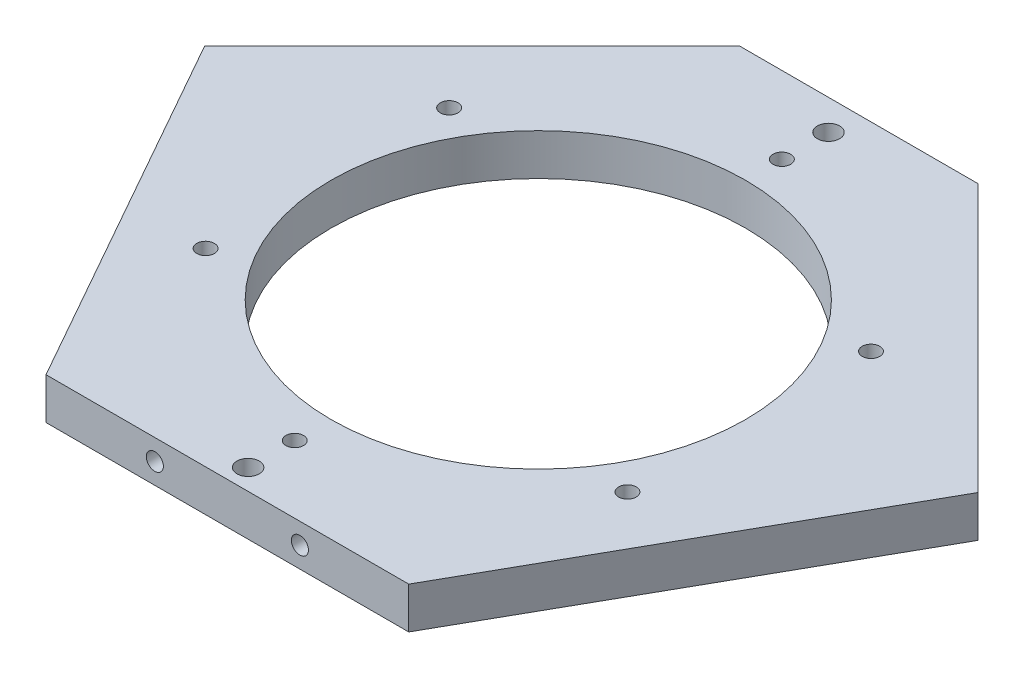
ISO-10303-21;
HEADER;
FILE_DESCRIPTION(('STEP AP214'),'2;1');
FILE_NAME('part.step','',(''),(''),'','','');
FILE_SCHEMA(('AUTOMOTIVE_DESIGN { 1 0 10303 214 1 1 1 1 }'));
ENDSEC;
DATA;
#1=APPLICATION_CONTEXT('core data for automotive mechanical design processes');
#2=APPLICATION_PROTOCOL_DEFINITION('international standard','automotive_design',2000,#1);
#3=PRODUCT_CONTEXT('',#1,'mechanical');
#4=PRODUCT('Part','Part','',(#3));
#5=PRODUCT_RELATED_PRODUCT_CATEGORY('part','',(#4));
#6=PRODUCT_DEFINITION_FORMATION('','',#4);
#7=PRODUCT_DEFINITION_CONTEXT('part definition',#1,'design');
#8=PRODUCT_DEFINITION('design','',#6,#7);
#9=PRODUCT_DEFINITION_SHAPE('','',#8);
#10=(LENGTH_UNIT() NAMED_UNIT(*) SI_UNIT(.MILLI.,.METRE.));
#11=(NAMED_UNIT(*) PLANE_ANGLE_UNIT() SI_UNIT($,.RADIAN.));
#12=(NAMED_UNIT(*) SI_UNIT($,.STERADIAN.) SOLID_ANGLE_UNIT());
#13=UNCERTAINTY_MEASURE_WITH_UNIT(LENGTH_MEASURE(1.E-05),#10,'distance_accuracy_value','');
#14=(GEOMETRIC_REPRESENTATION_CONTEXT(3) GLOBAL_UNCERTAINTY_ASSIGNED_CONTEXT((#13)) GLOBAL_UNIT_ASSIGNED_CONTEXT((#10,
#11,#12)) REPRESENTATION_CONTEXT('',''));
#15=CARTESIAN_POINT('',(0.,0.,0.));
#16=DIRECTION('',(0.,0.,1.));
#17=DIRECTION('',(1.,0.,0.));
#18=AXIS2_PLACEMENT_3D('',#15,#16,#17);
#19=CARTESIAN_POINT('',(0.,4.,0.));
#20=DIRECTION('',(0.,1.,0.));
#21=DIRECTION('',(0.,0.,1.));
#22=AXIS2_PLACEMENT_3D('',#19,#20,#21);
#23=PLANE('',#22);
#24=CARTESIAN_POINT('',(0.,4.,-56.));
#25=DIRECTION('',(0.,1.,0.));
#26=DIRECTION('',(0.,0.,1.));
#27=AXIS2_PLACEMENT_3D('',#24,#25,#26);
#28=CIRCLE('',#27,2.15);
#29=CARTESIAN_POINT('',(0.,4.,-53.85));
#30=VERTEX_POINT('',#29);
#31=EDGE_CURVE('E266',#30,#30,#28,.T.);
#32=ORIENTED_EDGE('',*,*,#31,.F.);
#33=EDGE_LOOP('',(#32));
#34=FACE_BOUND('',#33,.T.);
#35=CARTESIAN_POINT('',(0.,4.,56.));
#36=DIRECTION('',(0.,1.,0.));
#37=DIRECTION('',(0.,0.,1.));
#38=AXIS2_PLACEMENT_3D('',#35,#36,#37);
#39=CIRCLE('',#38,2.15);
#40=CARTESIAN_POINT('',(0.,4.,58.15));
#41=VERTEX_POINT('',#40);
#42=EDGE_CURVE('E270',#41,#41,#39,.T.);
#43=ORIENTED_EDGE('',*,*,#42,.F.);
#44=EDGE_LOOP('',(#43));
#45=FACE_BOUND('',#44,.T.);
#46=CARTESIAN_POINT('',(0.,4.,-47.));
#47=DIRECTION('',(0.,1.,0.));
#48=DIRECTION('',(0.,0.,1.));
#49=AXIS2_PLACEMENT_3D('',#46,#47,#48);
#50=CIRCLE('',#49,1.69999999999999);
#51=CARTESIAN_POINT('',(0.,4.,-45.3));
#52=VERTEX_POINT('',#51);
#53=EDGE_CURVE('E316',#52,#52,#50,.T.);
#54=ORIENTED_EDGE('',*,*,#53,.F.);
#55=EDGE_LOOP('',(#54));
#56=FACE_BOUND('',#55,.T.);
#57=CARTESIAN_POINT('',(40.7031939778709,4.,-23.5000000000041));
#58=DIRECTION('',(0.,1.,0.));
#59=DIRECTION('',(0.,0.,1.));
#60=AXIS2_PLACEMENT_3D('',#57,#58,#59);
#61=CIRCLE('',#60,1.69999999999999);
#62=CARTESIAN_POINT('',(40.7031939778709,4.,-21.8000000000041));
#63=VERTEX_POINT('',#62);
#64=EDGE_CURVE('E323',#63,#63,#61,.T.);
#65=ORIENTED_EDGE('',*,*,#64,.F.);
#66=EDGE_LOOP('',(#65));
#67=FACE_BOUND('',#66,.T.);
#68=CARTESIAN_POINT('',(40.7031939778756,4.,23.4999999999959));
#69=DIRECTION('',(0.,1.,0.));
#70=DIRECTION('',(0.,0.,1.));
#71=AXIS2_PLACEMENT_3D('',#68,#69,#70);
#72=CIRCLE('',#71,1.69999999999999);
#73=CARTESIAN_POINT('',(40.7031939778756,4.,25.1999999999959));
#74=VERTEX_POINT('',#73);
#75=EDGE_CURVE('E329',#74,#74,#72,.T.);
#76=ORIENTED_EDGE('',*,*,#75,.F.);
#77=EDGE_LOOP('',(#76));
#78=FACE_BOUND('',#77,.T.);
#79=CARTESIAN_POINT('',(9.33923072269093E-12,4.,47.));
#80=DIRECTION('',(0.,1.,0.));
#81=DIRECTION('',(0.,0.,1.));
#82=AXIS2_PLACEMENT_3D('',#79,#80,#81);
#83=CIRCLE('',#82,1.69999999999999);
#84=CARTESIAN_POINT('',(9.33923072269093E-12,4.,48.7));
#85=VERTEX_POINT('',#84);
#86=EDGE_CURVE('E335',#85,#85,#83,.T.);
#87=ORIENTED_EDGE('',*,*,#86,.F.);
#88=EDGE_LOOP('',(#87));
#89=FACE_BOUND('',#88,.T.);
#90=CARTESIAN_POINT('',(-40.7031939778616,4.,23.5000000000041));
#91=DIRECTION('',(0.,1.,0.));
#92=DIRECTION('',(0.,0.,1.));
#93=AXIS2_PLACEMENT_3D('',#90,#91,#92);
#94=CIRCLE('',#93,1.69999999999999);
#95=CARTESIAN_POINT('',(-40.7031939778616,4.,25.200000000004));
#96=VERTEX_POINT('',#95);
#97=EDGE_CURVE('E343',#96,#96,#94,.T.);
#98=ORIENTED_EDGE('',*,*,#97,.F.);
#99=EDGE_LOOP('',(#98));
#100=FACE_BOUND('',#99,.T.);
#101=CARTESIAN_POINT('',(-40.7031939778663,4.,-23.499999999996));
#102=DIRECTION('',(0.,1.,0.));
#103=DIRECTION('',(0.,0.,1.));
#104=AXIS2_PLACEMENT_3D('',#101,#102,#103);
#105=CIRCLE('',#104,1.69999999999999);
#106=CARTESIAN_POINT('',(-40.7031939778663,4.,-21.799999999996));
#107=VERTEX_POINT('',#106);
#108=EDGE_CURVE('E350',#107,#107,#105,.T.);
#109=ORIENTED_EDGE('',*,*,#108,.F.);
#110=EDGE_LOOP('',(#109));
#111=FACE_BOUND('',#110,.T.);
#112=DIRECTION('',(-0.707106781186547,0.,-0.707106781186548));
#113=VECTOR('',#112,1.);
#114=CARTESIAN_POINT('',(74.6187950266179,4.,-10.2340187157677));
#115=LINE('',#114,#113);
#116=CARTESIAN_POINT('',(74.6187950266179,4.,-10.2340187157677));
#117=VERTEX_POINT('',#116);
#118=CARTESIAN_POINT('',(23.,4.,-61.8528137423857));
#119=VERTEX_POINT('',#118);
#120=EDGE_CURVE('E144',#117,#119,#115,.T.);
#121=ORIENTED_EDGE('',*,*,#120,.T.);
#122=DIRECTION('',(-1.,0.,0.));
#123=VECTOR('',#122,1.);
#124=CARTESIAN_POINT('',(23.,4.,-61.8528137423857));
#125=LINE('',#124,#123);
#126=CARTESIAN_POINT('',(-23.,4.,-61.8528137423857));
#127=VERTEX_POINT('',#126);
#128=EDGE_CURVE('E100',#119,#127,#125,.T.);
#129=ORIENTED_EDGE('',*,*,#128,.T.);
#130=DIRECTION('',(-0.707106781186547,0.,0.707106781186548));
#131=VECTOR('',#130,1.);
#132=CARTESIAN_POINT('',(-23.,4.,-61.8528137423857));
#133=LINE('',#132,#131);
#134=CARTESIAN_POINT('',(-74.6187950266179,4.,-10.2340187157677));
#135=VERTEX_POINT('',#134);
#136=EDGE_CURVE('E115',#127,#135,#133,.T.);
#137=ORIENTED_EDGE('',*,*,#136,.T.);
#138=DIRECTION('',(0.491317470780659,0.,0.870980564022927));
#139=VECTOR('',#138,1.);
#140=CARTESIAN_POINT('',(-74.6187950266179,4.,-10.2340187157677));
#141=LINE('',#140,#139);
#142=CARTESIAN_POINT('',(-35.,4.,60.));
#143=VERTEX_POINT('',#142);
#144=EDGE_CURVE('E109',#135,#143,#141,.T.);
#145=ORIENTED_EDGE('',*,*,#144,.T.);
#146=DIRECTION('',(1.,0.,0.));
#147=VECTOR('',#146,1.);
#148=CARTESIAN_POINT('',(-35.,4.,60.));
#149=LINE('',#148,#147);
#150=CARTESIAN_POINT('',(35.,4.,60.));
#151=VERTEX_POINT('',#150);
#152=EDGE_CURVE('E113',#143,#151,#149,.T.);
#153=ORIENTED_EDGE('',*,*,#152,.T.);
#154=DIRECTION('',(0.491317470780659,0.,-0.870980564022927));
#155=VECTOR('',#154,1.);
#156=CARTESIAN_POINT('',(35.,4.,60.));
#157=LINE('',#156,#155);
#158=EDGE_CURVE('E62',#151,#117,#157,.T.);
#159=ORIENTED_EDGE('',*,*,#158,.T.);
#160=EDGE_LOOP('',(#121,#129,#137,#145,#153,#159));
#161=FACE_BOUND('',#160,.T.);
#162=CARTESIAN_POINT('',(0.,4.,0.));
#163=DIRECTION('',(0.,1.,0.));
#164=DIRECTION('',(0.,0.,1.));
#165=AXIS2_PLACEMENT_3D('',#162,#163,#164);
#166=CIRCLE('',#165,40.);
#167=CARTESIAN_POINT('',(0.,4.,40.));
#168=VERTEX_POINT('',#167);
#169=EDGE_CURVE('E137',#168,#168,#166,.T.);
#170=ORIENTED_EDGE('',*,*,#169,.F.);
#171=EDGE_LOOP('',(#170));
#172=FACE_BOUND('',#171,.T.);
#173=ADVANCED_FACE('F45',(#34,#45,#56,#67,#78,#89,#100,#111,#161,#172),#23,.T.);
#174=CARTESIAN_POINT('',(0.,-4.,0.));
#175=DIRECTION('',(0.,1.,0.));
#176=DIRECTION('',(0.,0.,1.));
#177=AXIS2_PLACEMENT_3D('',#174,#175,#176);
#178=PLANE('',#177);
#179=CARTESIAN_POINT('',(0.,-4.,-56.));
#180=DIRECTION('',(0.,1.,0.));
#181=DIRECTION('',(0.,0.,1.));
#182=AXIS2_PLACEMENT_3D('',#179,#180,#181);
#183=CIRCLE('',#182,2.15);
#184=CARTESIAN_POINT('',(0.,-4.,-53.85));
#185=VERTEX_POINT('',#184);
#186=EDGE_CURVE('E264',#185,#185,#183,.T.);
#187=ORIENTED_EDGE('',*,*,#186,.T.);
#188=EDGE_LOOP('',(#187));
#189=FACE_BOUND('',#188,.T.);
#190=CARTESIAN_POINT('',(0.,-4.,56.));
#191=DIRECTION('',(0.,1.,0.));
#192=DIRECTION('',(0.,0.,1.));
#193=AXIS2_PLACEMENT_3D('',#190,#191,#192);
#194=CIRCLE('',#193,2.15);
#195=CARTESIAN_POINT('',(0.,-4.,58.15));
#196=VERTEX_POINT('',#195);
#197=EDGE_CURVE('E275',#196,#196,#194,.T.);
#198=ORIENTED_EDGE('',*,*,#197,.T.);
#199=EDGE_LOOP('',(#198));
#200=FACE_BOUND('',#199,.T.);
#201=CARTESIAN_POINT('',(0.,-4.,-47.));
#202=DIRECTION('',(0.,1.,0.));
#203=DIRECTION('',(0.,0.,1.));
#204=AXIS2_PLACEMENT_3D('',#201,#202,#203);
#205=CIRCLE('',#204,1.7);
#206=CARTESIAN_POINT('',(0.,-4.,-45.3));
#207=VERTEX_POINT('',#206);
#208=EDGE_CURVE('E319',#207,#207,#205,.T.);
#209=ORIENTED_EDGE('',*,*,#208,.T.);
#210=EDGE_LOOP('',(#209));
#211=FACE_BOUND('',#210,.T.);
#212=CARTESIAN_POINT('',(40.7031939778709,-4.,-23.5000000000041));
#213=DIRECTION('',(0.,1.,0.));
#214=DIRECTION('',(0.,0.,1.));
#215=AXIS2_PLACEMENT_3D('',#212,#213,#214);
#216=CIRCLE('',#215,1.7);
#217=CARTESIAN_POINT('',(40.7031939778709,-4.,-21.800000000004));
#218=VERTEX_POINT('',#217);
#219=EDGE_CURVE('E326',#218,#218,#216,.T.);
#220=ORIENTED_EDGE('',*,*,#219,.T.);
#221=EDGE_LOOP('',(#220));
#222=FACE_BOUND('',#221,.T.);
#223=CARTESIAN_POINT('',(40.7031939778756,-4.,23.4999999999959));
#224=DIRECTION('',(0.,1.,0.));
#225=DIRECTION('',(0.,0.,1.));
#226=AXIS2_PLACEMENT_3D('',#223,#224,#225);
#227=CIRCLE('',#226,1.7);
#228=CARTESIAN_POINT('',(40.7031939778756,-4.,25.199999999996));
#229=VERTEX_POINT('',#228);
#230=EDGE_CURVE('E332',#229,#229,#227,.T.);
#231=ORIENTED_EDGE('',*,*,#230,.T.);
#232=EDGE_LOOP('',(#231));
#233=FACE_BOUND('',#232,.T.);
#234=CARTESIAN_POINT('',(9.33923072269093E-12,-4.,47.));
#235=DIRECTION('',(0.,1.,0.));
#236=DIRECTION('',(0.,0.,1.));
#237=AXIS2_PLACEMENT_3D('',#234,#235,#236);
#238=CIRCLE('',#237,1.7);
#239=CARTESIAN_POINT('',(9.33923072269093E-12,-4.,48.7));
#240=VERTEX_POINT('',#239);
#241=EDGE_CURVE('E339',#240,#240,#238,.T.);
#242=ORIENTED_EDGE('',*,*,#241,.T.);
#243=EDGE_LOOP('',(#242));
#244=FACE_BOUND('',#243,.T.);
#245=CARTESIAN_POINT('',(-40.7031939778616,-4.,23.5000000000041));
#246=DIRECTION('',(0.,1.,0.));
#247=DIRECTION('',(0.,0.,1.));
#248=AXIS2_PLACEMENT_3D('',#245,#246,#247);
#249=CIRCLE('',#248,1.7);
#250=CARTESIAN_POINT('',(-40.7031939778616,-4.,25.2000000000041));
#251=VERTEX_POINT('',#250);
#252=EDGE_CURVE('E347',#251,#251,#249,.T.);
#253=ORIENTED_EDGE('',*,*,#252,.T.);
#254=EDGE_LOOP('',(#253));
#255=FACE_BOUND('',#254,.T.);
#256=CARTESIAN_POINT('',(-40.7031939778663,-4.,-23.499999999996));
#257=DIRECTION('',(0.,1.,0.));
#258=DIRECTION('',(0.,0.,1.));
#259=AXIS2_PLACEMENT_3D('',#256,#257,#258);
#260=CIRCLE('',#259,1.7);
#261=CARTESIAN_POINT('',(-40.7031939778663,-4.,-21.799999999996));
#262=VERTEX_POINT('',#261);
#263=EDGE_CURVE('E353',#262,#262,#260,.T.);
#264=ORIENTED_EDGE('',*,*,#263,.T.);
#265=EDGE_LOOP('',(#264));
#266=FACE_BOUND('',#265,.T.);
#267=DIRECTION('',(-0.707106781186547,0.,-0.707106781186548));
#268=VECTOR('',#267,1.);
#269=CARTESIAN_POINT('',(74.6187950266179,-4.,-10.2340187157677));
#270=LINE('',#269,#268);
#271=CARTESIAN_POINT('',(74.6187950266179,-4.,-10.2340187157677));
#272=VERTEX_POINT('',#271);
#273=CARTESIAN_POINT('',(23.,-4.,-61.8528137423857));
#274=VERTEX_POINT('',#273);
#275=EDGE_CURVE('E133',#272,#274,#270,.T.);
#276=ORIENTED_EDGE('',*,*,#275,.F.);
#277=DIRECTION('',(0.491317470780659,0.,-0.870980564022927));
#278=VECTOR('',#277,1.);
#279=CARTESIAN_POINT('',(35.,-4.,60.));
#280=LINE('',#279,#278);
#281=CARTESIAN_POINT('',(35.,-4.,60.));
#282=VERTEX_POINT('',#281);
#283=EDGE_CURVE('E92',#282,#272,#280,.T.);
#284=ORIENTED_EDGE('',*,*,#283,.F.);
#285=DIRECTION('',(1.,0.,0.));
#286=VECTOR('',#285,1.);
#287=CARTESIAN_POINT('',(-35.,-4.,60.));
#288=LINE('',#287,#286);
#289=CARTESIAN_POINT('',(-35.,-4.,60.));
#290=VERTEX_POINT('',#289);
#291=EDGE_CURVE('E86',#290,#282,#288,.T.);
#292=ORIENTED_EDGE('',*,*,#291,.F.);
#293=DIRECTION('',(0.491317470780659,0.,0.870980564022927));
#294=VECTOR('',#293,1.);
#295=CARTESIAN_POINT('',(-74.6187950266179,-4.,-10.2340187157677));
#296=LINE('',#295,#294);
#297=CARTESIAN_POINT('',(-74.6187950266179,-4.,-10.2340187157677));
#298=VERTEX_POINT('',#297);
#299=EDGE_CURVE('E123',#298,#290,#296,.T.);
#300=ORIENTED_EDGE('',*,*,#299,.F.);
#301=DIRECTION('',(-0.707106781186547,0.,0.707106781186548));
#302=VECTOR('',#301,1.);
#303=CARTESIAN_POINT('',(-23.,-4.,-61.8528137423857));
#304=LINE('',#303,#302);
#305=CARTESIAN_POINT('',(-23.,-4.,-61.8528137423857));
#306=VERTEX_POINT('',#305);
#307=EDGE_CURVE('E139',#306,#298,#304,.T.);
#308=ORIENTED_EDGE('',*,*,#307,.F.);
#309=DIRECTION('',(-1.,0.,0.));
#310=VECTOR('',#309,1.);
#311=CARTESIAN_POINT('',(23.,-4.,-61.8528137423857));
#312=LINE('',#311,#310);
#313=EDGE_CURVE('E136',#274,#306,#312,.T.);
#314=ORIENTED_EDGE('',*,*,#313,.F.);
#315=EDGE_LOOP('',(#276,#284,#292,#300,#308,#314));
#316=FACE_BOUND('',#315,.T.);
#317=CARTESIAN_POINT('',(0.,-4.,0.));
#318=DIRECTION('',(0.,1.,0.));
#319=DIRECTION('',(0.,0.,1.));
#320=AXIS2_PLACEMENT_3D('',#317,#318,#319);
#321=CIRCLE('',#320,40.);
#322=CARTESIAN_POINT('',(0.,-4.,40.));
#323=VERTEX_POINT('',#322);
#324=EDGE_CURVE('E356',#323,#323,#321,.T.);
#325=ORIENTED_EDGE('',*,*,#324,.T.);
#326=EDGE_LOOP('',(#325));
#327=FACE_BOUND('',#326,.T.);
#328=ADVANCED_FACE('F153',(#189,#200,#211,#222,#233,#244,#255,#266,#316,#327),#178,.F.);
#329=CARTESIAN_POINT('',(74.6187950266179,4.,-10.2340187157677));
#330=DIRECTION('',(-0.707106781186548,0.,0.707106781186547));
#331=DIRECTION('',(0.707106781186547,0.,0.707106781186548));
#332=AXIS2_PLACEMENT_3D('',#329,#330,#331);
#333=PLANE('',#332);
#334=CARTESIAN_POINT('',(38.8201622871415,0.,-46.0326514552443));
#335=DIRECTION('',(0.707106781186548,0.,-0.707106781186548));
#336=DIRECTION('',(-0.707106781186548,0.,-0.707106781186548));
#337=AXIS2_PLACEMENT_3D('',#334,#335,#336);
#338=CIRCLE('',#337,1.64999999999999);
#339=CARTESIAN_POINT('',(37.6534360981837,0.,-47.199377644202));
#340=VERTEX_POINT('',#339);
#341=EDGE_CURVE('E304',#340,#340,#338,.T.);
#342=ORIENTED_EDGE('',*,*,#341,.F.);
#343=EDGE_LOOP('',(#342));
#344=FACE_BOUND('',#343,.T.);
#345=CARTESIAN_POINT('',(58.6191521603648,0.,-26.2336615820209));
#346=DIRECTION('',(0.707106781186548,0.,-0.707106781186548));
#347=DIRECTION('',(-0.707106781186548,0.,-0.707106781186548));
#348=AXIS2_PLACEMENT_3D('',#345,#346,#347);
#349=CIRCLE('',#348,1.64999999999999);
#350=CARTESIAN_POINT('',(57.452425971407,0.,-27.4003877709787));
#351=VERTEX_POINT('',#350);
#352=EDGE_CURVE('E310',#351,#351,#349,.T.);
#353=ORIENTED_EDGE('',*,*,#352,.F.);
#354=EDGE_LOOP('',(#353));
#355=FACE_BOUND('',#354,.T.);
#356=ORIENTED_EDGE('',*,*,#275,.T.);
#357=DIRECTION('',(0.,-1.,0.));
#358=VECTOR('',#357,1.);
#359=CARTESIAN_POINT('',(23.,4.,-61.8528137423857));
#360=LINE('',#359,#358);
#361=EDGE_CURVE('E11',#119,#274,#360,.T.);
#362=ORIENTED_EDGE('',*,*,#361,.F.);
#363=ORIENTED_EDGE('',*,*,#120,.F.);
#364=DIRECTION('',(0.,-1.,0.));
#365=VECTOR('',#364,1.);
#366=CARTESIAN_POINT('',(74.6187950266179,4.,-10.2340187157677));
#367=LINE('',#366,#365);
#368=EDGE_CURVE('E129',#117,#272,#367,.T.);
#369=ORIENTED_EDGE('',*,*,#368,.T.);
#370=EDGE_LOOP('',(#356,#362,#363,#369));
#371=FACE_BOUND('',#370,.T.);
#372=ADVANCED_FACE('F47',(#344,#355,#371),#333,.F.);
#373=CARTESIAN_POINT('',(23.,4.,-61.8528137423857));
#374=DIRECTION('',(0.,0.,1.));
#375=DIRECTION('',(1.,0.,0.));
#376=AXIS2_PLACEMENT_3D('',#373,#374,#375);
#377=PLANE('',#376);
#378=ORIENTED_EDGE('',*,*,#313,.T.);
#379=DIRECTION('',(0.,-1.,0.));
#380=VECTOR('',#379,1.);
#381=CARTESIAN_POINT('',(-23.,4.,-61.8528137423857));
#382=LINE('',#381,#380);
#383=EDGE_CURVE('E54',#127,#306,#382,.T.);
#384=ORIENTED_EDGE('',*,*,#383,.F.);
#385=ORIENTED_EDGE('',*,*,#128,.F.);
#386=ORIENTED_EDGE('',*,*,#361,.T.);
#387=EDGE_LOOP('',(#378,#384,#385,#386));
#388=FACE_BOUND('',#387,.T.);
#389=ADVANCED_FACE('F403',(#388),#377,.F.);
#390=CARTESIAN_POINT('',(-23.,4.,-61.8528137423857));
#391=DIRECTION('',(0.707106781186548,0.,0.707106781186547));
#392=DIRECTION('',(0.707106781186547,0.,-0.707106781186548));
#393=AXIS2_PLACEMENT_3D('',#390,#391,#392);
#394=PLANE('',#393);
#395=CARTESIAN_POINT('',(-38.8201622871415,0.,-46.0326514552443));
#396=DIRECTION('',(-0.707106781186548,0.,-0.707106781186548));
#397=DIRECTION('',(-0.707106781186548,0.,0.707106781186548));
#398=AXIS2_PLACEMENT_3D('',#395,#396,#397);
#399=CIRCLE('',#398,1.64999999999999);
#400=CARTESIAN_POINT('',(-39.9868884760993,0.,-44.8659252662865));
#401=VERTEX_POINT('',#400);
#402=EDGE_CURVE('E292',#401,#401,#399,.T.);
#403=ORIENTED_EDGE('',*,*,#402,.F.);
#404=EDGE_LOOP('',(#403));
#405=FACE_BOUND('',#404,.T.);
#406=CARTESIAN_POINT('',(-58.6191521603648,0.,-26.2336615820209));
#407=DIRECTION('',(-0.707106781186548,0.,-0.707106781186548));
#408=DIRECTION('',(-0.707106781186548,0.,0.707106781186548));
#409=AXIS2_PLACEMENT_3D('',#406,#407,#408);
#410=CIRCLE('',#409,1.64999999999999);
#411=CARTESIAN_POINT('',(-59.7858783493226,0.,-25.0669353930631));
#412=VERTEX_POINT('',#411);
#413=EDGE_CURVE('E298',#412,#412,#410,.T.);
#414=ORIENTED_EDGE('',*,*,#413,.F.);
#415=EDGE_LOOP('',(#414));
#416=FACE_BOUND('',#415,.T.);
#417=ORIENTED_EDGE('',*,*,#307,.T.);
#418=DIRECTION('',(0.,-1.,0.));
#419=VECTOR('',#418,1.);
#420=CARTESIAN_POINT('',(-74.6187950266179,4.,-10.2340187157677));
#421=LINE('',#420,#419);
#422=EDGE_CURVE('E124',#135,#298,#421,.T.);
#423=ORIENTED_EDGE('',*,*,#422,.F.);
#424=ORIENTED_EDGE('',*,*,#136,.F.);
#425=ORIENTED_EDGE('',*,*,#383,.T.);
#426=EDGE_LOOP('',(#417,#423,#424,#425));
#427=FACE_BOUND('',#426,.T.);
#428=ADVANCED_FACE('F150',(#405,#416,#427),#394,.F.);
#429=CARTESIAN_POINT('',(-74.6187950266179,4.,-10.2340187157677));
#430=DIRECTION('',(0.870980564022927,0.,-0.491317470780659));
#431=DIRECTION('',(-0.491317470780659,0.,-0.870980564022927));
#432=AXIS2_PLACEMENT_3D('',#429,#430,#431);
#433=PLANE('',#432);
#434=ORIENTED_EDGE('',*,*,#299,.T.);
#435=DIRECTION('',(0.,-1.,0.));
#436=VECTOR('',#435,1.);
#437=CARTESIAN_POINT('',(-35.,4.,60.));
#438=LINE('',#437,#436);
#439=EDGE_CURVE('E120',#143,#290,#438,.T.);
#440=ORIENTED_EDGE('',*,*,#439,.F.);
#441=ORIENTED_EDGE('',*,*,#144,.F.);
#442=ORIENTED_EDGE('',*,*,#422,.T.);
#443=EDGE_LOOP('',(#434,#440,#441,#442));
#444=FACE_BOUND('',#443,.T.);
#445=ADVANCED_FACE('F121',(#444),#433,.F.);
#446=CARTESIAN_POINT('',(-35.,4.,60.));
#447=DIRECTION('',(0.,0.,-1.));
#448=DIRECTION('',(-1.,0.,0.));
#449=AXIS2_PLACEMENT_3D('',#446,#447,#448);
#450=PLANE('',#449);
#451=CARTESIAN_POINT('',(14.,0.,60.));
#452=DIRECTION('',(0.,0.,1.));
#453=DIRECTION('',(1.,0.,0.));
#454=AXIS2_PLACEMENT_3D('',#451,#452,#453);
#455=CIRCLE('',#454,1.64999999999999);
#456=CARTESIAN_POINT('',(15.65,0.,60.));
#457=VERTEX_POINT('',#456);
#458=EDGE_CURVE('E279',#457,#457,#455,.T.);
#459=ORIENTED_EDGE('',*,*,#458,.F.);
#460=EDGE_LOOP('',(#459));
#461=FACE_BOUND('',#460,.T.);
#462=CARTESIAN_POINT('',(-14.,0.,60.));
#463=DIRECTION('',(0.,0.,1.));
#464=DIRECTION('',(1.,0.,0.));
#465=AXIS2_PLACEMENT_3D('',#462,#463,#464);
#466=CIRCLE('',#465,1.64999999999999);
#467=CARTESIAN_POINT('',(-12.35,0.,60.));
#468=VERTEX_POINT('',#467);
#469=EDGE_CURVE('E285',#468,#468,#466,.T.);
#470=ORIENTED_EDGE('',*,*,#469,.F.);
#471=EDGE_LOOP('',(#470));
#472=FACE_BOUND('',#471,.T.);
#473=ORIENTED_EDGE('',*,*,#291,.T.);
#474=DIRECTION('',(0.,-1.,0.));
#475=VECTOR('',#474,1.);
#476=CARTESIAN_POINT('',(35.,4.,60.));
#477=LINE('',#476,#475);
#478=EDGE_CURVE('E125',#151,#282,#477,.T.);
#479=ORIENTED_EDGE('',*,*,#478,.F.);
#480=ORIENTED_EDGE('',*,*,#152,.F.);
#481=ORIENTED_EDGE('',*,*,#439,.T.);
#482=EDGE_LOOP('',(#473,#479,#480,#481));
#483=FACE_BOUND('',#482,.T.);
#484=ADVANCED_FACE('F127',(#461,#472,#483),#450,.F.);
#485=CARTESIAN_POINT('',(35.,4.,60.));
#486=DIRECTION('',(-0.870980564022927,0.,-0.491317470780659));
#487=DIRECTION('',(-0.491317470780659,0.,0.870980564022927));
#488=AXIS2_PLACEMENT_3D('',#485,#486,#487);
#489=PLANE('',#488);
#490=ORIENTED_EDGE('',*,*,#283,.T.);
#491=ORIENTED_EDGE('',*,*,#368,.F.);
#492=ORIENTED_EDGE('',*,*,#158,.F.);
#493=ORIENTED_EDGE('',*,*,#478,.T.);
#494=EDGE_LOOP('',(#490,#491,#492,#493));
#495=FACE_BOUND('',#494,.T.);
#496=ADVANCED_FACE('F158',(#495),#489,.F.);
#497=CARTESIAN_POINT('',(0.,4.,0.));
#498=DIRECTION('',(0.,-1.,0.));
#499=DIRECTION('',(0.,0.,-1.));
#500=AXIS2_PLACEMENT_3D('',#497,#498,#499);
#501=CYLINDRICAL_SURFACE('',#500,40.);
#502=ORIENTED_EDGE('',*,*,#169,.T.);
#503=EDGE_LOOP('',(#502));
#504=FACE_BOUND('',#503,.T.);
#505=ORIENTED_EDGE('',*,*,#324,.F.);
#506=EDGE_LOOP('',(#505));
#507=FACE_BOUND('',#506,.T.);
#508=ADVANCED_FACE('F160',(#504,#507),#501,.F.);
#509=CARTESIAN_POINT('',(-40.7031939778663,4.,-23.499999999996));
#510=DIRECTION('',(0.,1.,0.));
#511=DIRECTION('',(0.,0.,1.));
#512=AXIS2_PLACEMENT_3D('',#509,#510,#511);
#513=CYLINDRICAL_SURFACE('',#512,1.69999999999999);
#514=ORIENTED_EDGE('',*,*,#263,.F.);
#515=EDGE_LOOP('',(#514));
#516=FACE_BOUND('',#515,.T.);
#517=ORIENTED_EDGE('',*,*,#108,.T.);
#518=EDGE_LOOP('',(#517));
#519=FACE_BOUND('',#518,.T.);
#520=ADVANCED_FACE('F166',(#516,#519),#513,.F.);
#521=CARTESIAN_POINT('',(-40.7031939778616,4.,23.5000000000041));
#522=DIRECTION('',(0.,1.,0.));
#523=DIRECTION('',(0.,0.,1.));
#524=AXIS2_PLACEMENT_3D('',#521,#522,#523);
#525=CYLINDRICAL_SURFACE('',#524,1.69999999999999);
#526=ORIENTED_EDGE('',*,*,#252,.F.);
#527=EDGE_LOOP('',(#526));
#528=FACE_BOUND('',#527,.T.);
#529=ORIENTED_EDGE('',*,*,#97,.T.);
#530=EDGE_LOOP('',(#529));
#531=FACE_BOUND('',#530,.T.);
#532=ADVANCED_FACE('F184',(#528,#531),#525,.F.);
#533=CARTESIAN_POINT('',(9.33923072269093E-12,4.,47.));
#534=DIRECTION('',(0.,1.,0.));
#535=DIRECTION('',(0.,0.,1.));
#536=AXIS2_PLACEMENT_3D('',#533,#534,#535);
#537=CYLINDRICAL_SURFACE('',#536,1.69999999999999);
#538=ORIENTED_EDGE('',*,*,#241,.F.);
#539=EDGE_LOOP('',(#538));
#540=FACE_BOUND('',#539,.T.);
#541=ORIENTED_EDGE('',*,*,#86,.T.);
#542=EDGE_LOOP('',(#541));
#543=FACE_BOUND('',#542,.T.);
#544=ADVANCED_FACE('F188',(#540,#543),#537,.F.);
#545=CARTESIAN_POINT('',(40.7031939778756,4.,23.4999999999959));
#546=DIRECTION('',(0.,1.,0.));
#547=DIRECTION('',(0.,0.,1.));
#548=AXIS2_PLACEMENT_3D('',#545,#546,#547);
#549=CYLINDRICAL_SURFACE('',#548,1.69999999999999);
#550=ORIENTED_EDGE('',*,*,#230,.F.);
#551=EDGE_LOOP('',(#550));
#552=FACE_BOUND('',#551,.T.);
#553=ORIENTED_EDGE('',*,*,#75,.T.);
#554=EDGE_LOOP('',(#553));
#555=FACE_BOUND('',#554,.T.);
#556=ADVANCED_FACE('F192',(#552,#555),#549,.F.);
#557=CARTESIAN_POINT('',(40.7031939778709,4.,-23.5000000000041));
#558=DIRECTION('',(0.,1.,0.));
#559=DIRECTION('',(0.,0.,1.));
#560=AXIS2_PLACEMENT_3D('',#557,#558,#559);
#561=CYLINDRICAL_SURFACE('',#560,1.69999999999999);
#562=ORIENTED_EDGE('',*,*,#219,.F.);
#563=EDGE_LOOP('',(#562));
#564=FACE_BOUND('',#563,.T.);
#565=ORIENTED_EDGE('',*,*,#64,.T.);
#566=EDGE_LOOP('',(#565));
#567=FACE_BOUND('',#566,.T.);
#568=ADVANCED_FACE('F196',(#564,#567),#561,.F.);
#569=CARTESIAN_POINT('',(0.,4.,-47.));
#570=DIRECTION('',(0.,1.,0.));
#571=DIRECTION('',(0.,0.,1.));
#572=AXIS2_PLACEMENT_3D('',#569,#570,#571);
#573=CYLINDRICAL_SURFACE('',#572,1.69999999999999);
#574=ORIENTED_EDGE('',*,*,#208,.F.);
#575=EDGE_LOOP('',(#574));
#576=FACE_BOUND('',#575,.T.);
#577=ORIENTED_EDGE('',*,*,#53,.T.);
#578=EDGE_LOOP('',(#577));
#579=FACE_BOUND('',#578,.T.);
#580=ADVANCED_FACE('F200',(#576,#579),#573,.F.);
#581=CARTESIAN_POINT('',(50.1338707861262,0.,-17.7483802077824));
#582=DIRECTION('',(0.707106781186548,0.,-0.707106781186548));
#583=DIRECTION('',(-0.707106781186548,0.,-0.707106781186548));
#584=AXIS2_PLACEMENT_3D('',#581,#582,#583);
#585=CONICAL_SURFACE('',#584,1.65,1.02974425867665);
#586=CARTESIAN_POINT('',(49.4328309659934,0.,-17.0473403876495));
#587=VERTEX_POINT('',#586);
#588=VERTEX_LOOP('',#587);
#589=FACE_BOUND('',#588,.T.);
#590=CARTESIAN_POINT('',(50.1338707861262,0.,-17.7483802077824));
#591=DIRECTION('',(0.707106781186548,0.,-0.707106781186548));
#592=DIRECTION('',(-0.707106781186548,0.,-0.707106781186548));
#593=AXIS2_PLACEMENT_3D('',#590,#591,#592);
#594=CIRCLE('',#593,1.65);
#595=CARTESIAN_POINT('',(48.9671445971684,0.,-18.9151063967402));
#596=VERTEX_POINT('',#595);
#597=EDGE_CURVE('E313',#596,#596,#594,.T.);
#598=ORIENTED_EDGE('',*,*,#597,.T.);
#599=EDGE_LOOP('',(#598));
#600=FACE_BOUND('',#599,.T.);
#601=ADVANCED_FACE('F204',(#589,#600),#585,.F.);
#602=CARTESIAN_POINT('',(58.6191521603648,0.,-26.2336615820209));
#603=DIRECTION('',(0.707106781186548,0.,-0.707106781186548));
#604=DIRECTION('',(-0.707106781186548,0.,-0.707106781186548));
#605=AXIS2_PLACEMENT_3D('',#602,#603,#604);
#606=CYLINDRICAL_SURFACE('',#605,1.64999999999999);
#607=ORIENTED_EDGE('',*,*,#597,.F.);
#608=EDGE_LOOP('',(#607));
#609=FACE_BOUND('',#608,.T.);
#610=ORIENTED_EDGE('',*,*,#352,.T.);
#611=EDGE_LOOP('',(#610));
#612=FACE_BOUND('',#611,.T.);
#613=ADVANCED_FACE('F208',(#609,#612),#606,.F.);
#614=CARTESIAN_POINT('',(30.3348809129029,0.,-37.5473700810057));
#615=DIRECTION('',(0.707106781186548,0.,-0.707106781186548));
#616=DIRECTION('',(-0.707106781186548,0.,-0.707106781186548));
#617=AXIS2_PLACEMENT_3D('',#614,#615,#616);
#618=CONICAL_SURFACE('',#617,1.65,1.02974425867665);
#619=CARTESIAN_POINT('',(29.6338410927701,0.,-36.8463302608728));
#620=VERTEX_POINT('',#619);
#621=VERTEX_LOOP('',#620);
#622=FACE_BOUND('',#621,.T.);
#623=CARTESIAN_POINT('',(30.3348809129029,0.,-37.5473700810057));
#624=DIRECTION('',(0.707106781186548,0.,-0.707106781186548));
#625=DIRECTION('',(-0.707106781186548,0.,-0.707106781186548));
#626=AXIS2_PLACEMENT_3D('',#623,#624,#625);
#627=CIRCLE('',#626,1.65);
#628=CARTESIAN_POINT('',(29.1681547239451,0.,-38.7140962699635));
#629=VERTEX_POINT('',#628);
#630=EDGE_CURVE('E307',#629,#629,#627,.T.);
#631=ORIENTED_EDGE('',*,*,#630,.T.);
#632=EDGE_LOOP('',(#631));
#633=FACE_BOUND('',#632,.T.);
#634=ADVANCED_FACE('F212',(#622,#633),#618,.F.);
#635=CARTESIAN_POINT('',(38.8201622871415,0.,-46.0326514552443));
#636=DIRECTION('',(0.707106781186548,0.,-0.707106781186548));
#637=DIRECTION('',(-0.707106781186548,0.,-0.707106781186548));
#638=AXIS2_PLACEMENT_3D('',#635,#636,#637);
#639=CYLINDRICAL_SURFACE('',#638,1.64999999999999);
#640=ORIENTED_EDGE('',*,*,#630,.F.);
#641=EDGE_LOOP('',(#640));
#642=FACE_BOUND('',#641,.T.);
#643=ORIENTED_EDGE('',*,*,#341,.T.);
#644=EDGE_LOOP('',(#643));
#645=FACE_BOUND('',#644,.T.);
#646=ADVANCED_FACE('F216',(#642,#645),#639,.F.);
#647=CARTESIAN_POINT('',(-50.1338707861262,0.,-17.7483802077824));
#648=DIRECTION('',(-0.707106781186548,0.,-0.707106781186548));
#649=DIRECTION('',(-0.707106781186548,0.,0.707106781186548));
#650=AXIS2_PLACEMENT_3D('',#647,#648,#649);
#651=CONICAL_SURFACE('',#650,1.65,1.02974425867665);
#652=CARTESIAN_POINT('',(-49.4328309659934,0.,-17.0473403876495));
#653=VERTEX_POINT('',#652);
#654=VERTEX_LOOP('',#653);
#655=FACE_BOUND('',#654,.T.);
#656=CARTESIAN_POINT('',(-50.1338707861262,0.,-17.7483802077824));
#657=DIRECTION('',(-0.707106781186548,0.,-0.707106781186548));
#658=DIRECTION('',(-0.707106781186548,0.,0.707106781186548));
#659=AXIS2_PLACEMENT_3D('',#656,#657,#658);
#660=CIRCLE('',#659,1.65);
#661=CARTESIAN_POINT('',(-51.300596975084,0.,-16.5816540188246));
#662=VERTEX_POINT('',#661);
#663=EDGE_CURVE('E301',#662,#662,#660,.T.);
#664=ORIENTED_EDGE('',*,*,#663,.T.);
#665=EDGE_LOOP('',(#664));
#666=FACE_BOUND('',#665,.T.);
#667=ADVANCED_FACE('F220',(#655,#666),#651,.F.);
#668=CARTESIAN_POINT('',(-58.6191521603648,0.,-26.2336615820209));
#669=DIRECTION('',(-0.707106781186548,0.,-0.707106781186548));
#670=DIRECTION('',(-0.707106781186548,0.,0.707106781186548));
#671=AXIS2_PLACEMENT_3D('',#668,#669,#670);
#672=CYLINDRICAL_SURFACE('',#671,1.64999999999999);
#673=ORIENTED_EDGE('',*,*,#663,.F.);
#674=EDGE_LOOP('',(#673));
#675=FACE_BOUND('',#674,.T.);
#676=ORIENTED_EDGE('',*,*,#413,.T.);
#677=EDGE_LOOP('',(#676));
#678=FACE_BOUND('',#677,.T.);
#679=ADVANCED_FACE('F224',(#675,#678),#672,.F.);
#680=CARTESIAN_POINT('',(-30.3348809129029,0.,-37.5473700810057));
#681=DIRECTION('',(-0.707106781186548,0.,-0.707106781186548));
#682=DIRECTION('',(-0.707106781186548,0.,0.707106781186548));
#683=AXIS2_PLACEMENT_3D('',#680,#681,#682);
#684=CONICAL_SURFACE('',#683,1.65,1.02974425867665);
#685=CARTESIAN_POINT('',(-29.6338410927701,0.,-36.8463302608728));
#686=VERTEX_POINT('',#685);
#687=VERTEX_LOOP('',#686);
#688=FACE_BOUND('',#687,.T.);
#689=CARTESIAN_POINT('',(-30.3348809129029,0.,-37.5473700810057));
#690=DIRECTION('',(-0.707106781186548,0.,-0.707106781186548));
#691=DIRECTION('',(-0.707106781186548,0.,0.707106781186548));
#692=AXIS2_PLACEMENT_3D('',#689,#690,#691);
#693=CIRCLE('',#692,1.65);
#694=CARTESIAN_POINT('',(-31.5016071018607,0.,-36.3806438920479));
#695=VERTEX_POINT('',#694);
#696=EDGE_CURVE('E295',#695,#695,#693,.T.);
#697=ORIENTED_EDGE('',*,*,#696,.T.);
#698=EDGE_LOOP('',(#697));
#699=FACE_BOUND('',#698,.T.);
#700=ADVANCED_FACE('F228',(#688,#699),#684,.F.);
#701=CARTESIAN_POINT('',(-38.8201622871415,0.,-46.0326514552443));
#702=DIRECTION('',(-0.707106781186548,0.,-0.707106781186548));
#703=DIRECTION('',(-0.707106781186548,0.,0.707106781186548));
#704=AXIS2_PLACEMENT_3D('',#701,#702,#703);
#705=CYLINDRICAL_SURFACE('',#704,1.64999999999999);
#706=ORIENTED_EDGE('',*,*,#696,.F.);
#707=EDGE_LOOP('',(#706));
#708=FACE_BOUND('',#707,.T.);
#709=ORIENTED_EDGE('',*,*,#402,.T.);
#710=EDGE_LOOP('',(#709));
#711=FACE_BOUND('',#710,.T.);
#712=ADVANCED_FACE('F232',(#708,#711),#705,.F.);
#713=CARTESIAN_POINT('',(-14.,0.,45.));
#714=DIRECTION('',(0.,0.,1.));
#715=DIRECTION('',(1.,0.,0.));
#716=AXIS2_PLACEMENT_3D('',#713,#714,#715);
#717=CONICAL_SURFACE('',#716,1.65,1.02974425867665);
#718=CARTESIAN_POINT('',(-14.,0.,44.0085799786045));
#719=VERTEX_POINT('',#718);
#720=VERTEX_LOOP('',#719);
#721=FACE_BOUND('',#720,.T.);
#722=CARTESIAN_POINT('',(-14.,0.,45.));
#723=DIRECTION('',(0.,0.,1.));
#724=DIRECTION('',(1.,0.,0.));
#725=AXIS2_PLACEMENT_3D('',#722,#723,#724);
#726=CIRCLE('',#725,1.65);
#727=CARTESIAN_POINT('',(-12.35,0.,45.));
#728=VERTEX_POINT('',#727);
#729=EDGE_CURVE('E288',#728,#728,#726,.T.);
#730=ORIENTED_EDGE('',*,*,#729,.T.);
#731=EDGE_LOOP('',(#730));
#732=FACE_BOUND('',#731,.T.);
#733=ADVANCED_FACE('F236',(#721,#732),#717,.F.);
#734=CARTESIAN_POINT('',(-14.,0.,60.));
#735=DIRECTION('',(0.,0.,1.));
#736=DIRECTION('',(1.,0.,0.));
#737=AXIS2_PLACEMENT_3D('',#734,#735,#736);
#738=CYLINDRICAL_SURFACE('',#737,1.64999999999999);
#739=ORIENTED_EDGE('',*,*,#729,.F.);
#740=EDGE_LOOP('',(#739));
#741=FACE_BOUND('',#740,.T.);
#742=ORIENTED_EDGE('',*,*,#469,.T.);
#743=EDGE_LOOP('',(#742));
#744=FACE_BOUND('',#743,.T.);
#745=ADVANCED_FACE('F240',(#741,#744),#738,.F.);
#746=CARTESIAN_POINT('',(14.,0.,45.));
#747=DIRECTION('',(0.,0.,1.));
#748=DIRECTION('',(1.,0.,0.));
#749=AXIS2_PLACEMENT_3D('',#746,#747,#748);
#750=CONICAL_SURFACE('',#749,1.65,1.02974425867665);
#751=CARTESIAN_POINT('',(14.,0.,44.0085799786045));
#752=VERTEX_POINT('',#751);
#753=VERTEX_LOOP('',#752);
#754=FACE_BOUND('',#753,.T.);
#755=CARTESIAN_POINT('',(14.,0.,45.));
#756=DIRECTION('',(0.,0.,1.));
#757=DIRECTION('',(1.,0.,0.));
#758=AXIS2_PLACEMENT_3D('',#755,#756,#757);
#759=CIRCLE('',#758,1.65);
#760=CARTESIAN_POINT('',(15.65,0.,45.));
#761=VERTEX_POINT('',#760);
#762=EDGE_CURVE('E282',#761,#761,#759,.T.);
#763=ORIENTED_EDGE('',*,*,#762,.T.);
#764=EDGE_LOOP('',(#763));
#765=FACE_BOUND('',#764,.T.);
#766=ADVANCED_FACE('F244',(#754,#765),#750,.F.);
#767=CARTESIAN_POINT('',(14.,0.,60.));
#768=DIRECTION('',(0.,0.,1.));
#769=DIRECTION('',(1.,0.,0.));
#770=AXIS2_PLACEMENT_3D('',#767,#768,#769);
#771=CYLINDRICAL_SURFACE('',#770,1.64999999999999);
#772=ORIENTED_EDGE('',*,*,#762,.F.);
#773=EDGE_LOOP('',(#772));
#774=FACE_BOUND('',#773,.T.);
#775=ORIENTED_EDGE('',*,*,#458,.T.);
#776=EDGE_LOOP('',(#775));
#777=FACE_BOUND('',#776,.T.);
#778=ADVANCED_FACE('F248',(#774,#777),#771,.F.);
#779=CARTESIAN_POINT('',(0.,4.,56.));
#780=DIRECTION('',(0.,1.,0.));
#781=DIRECTION('',(0.,0.,1.));
#782=AXIS2_PLACEMENT_3D('',#779,#780,#781);
#783=CYLINDRICAL_SURFACE('',#782,2.15);
#784=ORIENTED_EDGE('',*,*,#197,.F.);
#785=EDGE_LOOP('',(#784));
#786=FACE_BOUND('',#785,.T.);
#787=ORIENTED_EDGE('',*,*,#42,.T.);
#788=EDGE_LOOP('',(#787));
#789=FACE_BOUND('',#788,.T.);
#790=ADVANCED_FACE('F252',(#786,#789),#783,.F.);
#791=CARTESIAN_POINT('',(0.,4.,-56.));
#792=DIRECTION('',(0.,1.,0.));
#793=DIRECTION('',(0.,0.,1.));
#794=AXIS2_PLACEMENT_3D('',#791,#792,#793);
#795=CYLINDRICAL_SURFACE('',#794,2.15);
#796=ORIENTED_EDGE('',*,*,#186,.F.);
#797=EDGE_LOOP('',(#796));
#798=FACE_BOUND('',#797,.T.);
#799=ORIENTED_EDGE('',*,*,#31,.T.);
#800=EDGE_LOOP('',(#799));
#801=FACE_BOUND('',#800,.T.);
#802=ADVANCED_FACE('F256',(#798,#801),#795,.F.);
#803=CLOSED_SHELL('',(#173,#328,#372,#389,#428,#445,#484,#496,#508,#520,#532,#544,#556,#568,
#580,#601,#613,#634,#646,#667,#679,#700,#712,#733,#745,#766,#778,#790,#802));
#804=MANIFOLD_SOLID_BREP('B2',#803);
#805=ADVANCED_BREP_SHAPE_REPRESENTATION('',(#18,#804),#14);
#806=SHAPE_DEFINITION_REPRESENTATION(#9,#805);
ENDSEC;
END-ISO-10303-21;
